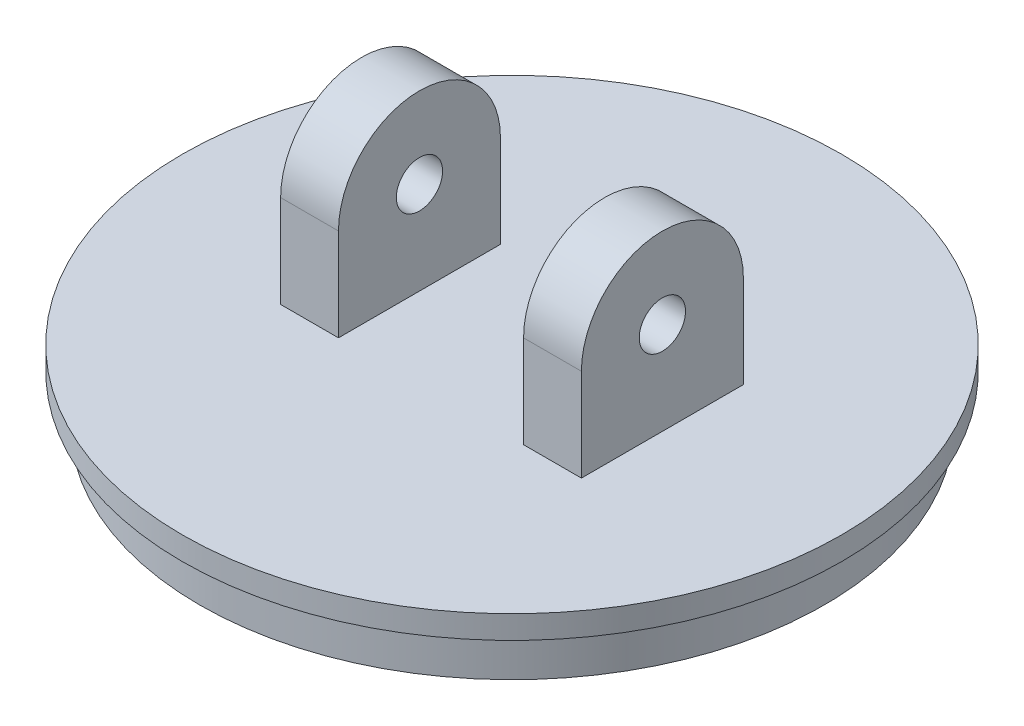
ISO-10303-21;
HEADER;
FILE_DESCRIPTION(('STEP AP214'),'2;1');
FILE_NAME('part.step','',(''),(''),'','','');
FILE_SCHEMA(('AUTOMOTIVE_DESIGN { 1 0 10303 214 1 1 1 1 }'));
ENDSEC;
DATA;
#1=APPLICATION_CONTEXT('core data for automotive mechanical design processes');
#2=APPLICATION_PROTOCOL_DEFINITION('international standard','automotive_design',2000,#1);
#3=PRODUCT_CONTEXT('',#1,'mechanical');
#4=PRODUCT('Part','Part','',(#3));
#5=PRODUCT_RELATED_PRODUCT_CATEGORY('part','',(#4));
#6=PRODUCT_DEFINITION_FORMATION('','',#4);
#7=PRODUCT_DEFINITION_CONTEXT('part definition',#1,'design');
#8=PRODUCT_DEFINITION('design','',#6,#7);
#9=PRODUCT_DEFINITION_SHAPE('','',#8);
#10=(LENGTH_UNIT() NAMED_UNIT(*) SI_UNIT(.MILLI.,.METRE.));
#11=(NAMED_UNIT(*) PLANE_ANGLE_UNIT() SI_UNIT($,.RADIAN.));
#12=(NAMED_UNIT(*) SI_UNIT($,.STERADIAN.) SOLID_ANGLE_UNIT());
#13=UNCERTAINTY_MEASURE_WITH_UNIT(LENGTH_MEASURE(1.E-05),#10,'distance_accuracy_value','');
#14=(GEOMETRIC_REPRESENTATION_CONTEXT(3) GLOBAL_UNCERTAINTY_ASSIGNED_CONTEXT((#13)) GLOBAL_UNIT_ASSIGNED_CONTEXT((#10,
#11,#12)) REPRESENTATION_CONTEXT('',''));
#15=CARTESIAN_POINT('',(0.,0.,0.));
#16=DIRECTION('',(0.,0.,1.));
#17=DIRECTION('',(1.,0.,0.));
#18=AXIS2_PLACEMENT_3D('',#15,#16,#17);
#19=CARTESIAN_POINT('',(40.,110.,-35.));
#20=DIRECTION('',(1.,0.,0.));
#21=DIRECTION('',(0.,0.,-1.));
#22=AXIS2_PLACEMENT_3D('',#19,#20,#21);
#23=PLANE('',#22);
#24=CARTESIAN_POINT('',(40.,70.,0.));
#25=DIRECTION('',(1.,0.,0.));
#26=DIRECTION('',(0.,0.,-1.));
#27=AXIS2_PLACEMENT_3D('',#24,#25,#26);
#28=CIRCLE('',#27,10.);
#29=CARTESIAN_POINT('',(40.,70.,-10.));
#30=VERTEX_POINT('',#29);
#31=EDGE_CURVE('E125',#30,#30,#28,.T.);
#32=ORIENTED_EDGE('',*,*,#31,.T.);
#33=EDGE_LOOP('',(#32));
#34=FACE_BOUND('',#33,.T.);
#35=DIRECTION('',(0.,-1.,0.));
#36=VECTOR('',#35,1.);
#37=CARTESIAN_POINT('',(40.,110.,35.));
#38=LINE('',#37,#36);
#39=CARTESIAN_POINT('',(40.,70.,35.));
#40=VERTEX_POINT('',#39);
#41=CARTESIAN_POINT('',(40.,30.,35.));
#42=VERTEX_POINT('',#41);
#43=EDGE_CURVE('E129',#40,#42,#38,.T.);
#44=ORIENTED_EDGE('',*,*,#43,.F.);
#45=CARTESIAN_POINT('',(40.,70.,0.));
#46=DIRECTION('',(1.,0.,0.));
#47=DIRECTION('',(0.,0.,-1.));
#48=AXIS2_PLACEMENT_3D('',#45,#46,#47);
#49=CIRCLE('',#48,35.);
#50=CARTESIAN_POINT('',(40.,70.,-35.));
#51=VERTEX_POINT('',#50);
#52=EDGE_CURVE('E111',#40,#51,#49,.F.);
#53=ORIENTED_EDGE('',*,*,#52,.T.);
#54=DIRECTION('',(0.,-1.,0.));
#55=VECTOR('',#54,1.);
#56=CARTESIAN_POINT('',(40.,110.,-35.));
#57=LINE('',#56,#55);
#58=CARTESIAN_POINT('',(40.,30.,-35.));
#59=VERTEX_POINT('',#58);
#60=EDGE_CURVE('E135',#51,#59,#57,.T.);
#61=ORIENTED_EDGE('',*,*,#60,.T.);
#62=DIRECTION('',(0.,0.,1.));
#63=VECTOR('',#62,1.);
#64=CARTESIAN_POINT('',(40.,30.,-35.));
#65=LINE('',#64,#63);
#66=EDGE_CURVE('E128',#59,#42,#65,.T.);
#67=ORIENTED_EDGE('',*,*,#66,.T.);
#68=EDGE_LOOP('',(#44,#53,#61,#67));
#69=FACE_BOUND('',#68,.T.);
#70=ADVANCED_FACE('F43',(#34,#69),#23,.F.);
#71=CARTESIAN_POINT('',(65.,110.,35.));
#72=DIRECTION('',(0.,0.,-1.));
#73=DIRECTION('',(-1.,0.,0.));
#74=AXIS2_PLACEMENT_3D('',#71,#72,#73);
#75=PLANE('',#74);
#76=DIRECTION('',(1.,0.,0.));
#77=VECTOR('',#76,1.);
#78=CARTESIAN_POINT('',(-142.5,70.,35.));
#79=LINE('',#78,#77);
#80=CARTESIAN_POINT('',(65.,70.,35.));
#81=VERTEX_POINT('',#80);
#82=EDGE_CURVE('E53',#40,#81,#79,.T.);
#83=ORIENTED_EDGE('',*,*,#82,.F.);
#84=ORIENTED_EDGE('',*,*,#43,.T.);
#85=DIRECTION('',(1.,0.,0.));
#86=VECTOR('',#85,1.);
#87=CARTESIAN_POINT('',(65.,30.,35.));
#88=LINE('',#87,#86);
#89=CARTESIAN_POINT('',(65.,30.,35.));
#90=VERTEX_POINT('',#89);
#91=EDGE_CURVE('E130',#42,#90,#88,.T.);
#92=ORIENTED_EDGE('',*,*,#91,.T.);
#93=DIRECTION('',(0.,-1.,0.));
#94=VECTOR('',#93,1.);
#95=CARTESIAN_POINT('',(65.,110.,35.));
#96=LINE('',#95,#94);
#97=EDGE_CURVE('E118',#81,#90,#96,.T.);
#98=ORIENTED_EDGE('',*,*,#97,.F.);
#99=EDGE_LOOP('',(#83,#84,#92,#98));
#100=FACE_BOUND('',#99,.T.);
#101=ADVANCED_FACE('F123',(#100),#75,.F.);
#102=CARTESIAN_POINT('',(-40.,110.,-35.));
#103=DIRECTION('',(-1.,0.,0.));
#104=DIRECTION('',(0.,0.,1.));
#105=AXIS2_PLACEMENT_3D('',#102,#103,#104);
#106=PLANE('',#105);
#107=CARTESIAN_POINT('',(-40.,70.,0.));
#108=DIRECTION('',(-1.,0.,0.));
#109=DIRECTION('',(0.,0.,1.));
#110=AXIS2_PLACEMENT_3D('',#107,#108,#109);
#111=CIRCLE('',#110,10.);
#112=CARTESIAN_POINT('',(-40.,70.,10.));
#113=VERTEX_POINT('',#112);
#114=EDGE_CURVE('E229',#113,#113,#111,.T.);
#115=ORIENTED_EDGE('',*,*,#114,.T.);
#116=EDGE_LOOP('',(#115));
#117=FACE_BOUND('',#116,.T.);
#118=DIRECTION('',(0.,-1.,0.));
#119=VECTOR('',#118,1.);
#120=CARTESIAN_POINT('',(-40.,110.,-35.));
#121=LINE('',#120,#119);
#122=CARTESIAN_POINT('',(-40.,70.,-35.));
#123=VERTEX_POINT('',#122);
#124=CARTESIAN_POINT('',(-40.,30.,-35.));
#125=VERTEX_POINT('',#124);
#126=EDGE_CURVE('E146',#123,#125,#121,.T.);
#127=ORIENTED_EDGE('',*,*,#126,.F.);
#128=CARTESIAN_POINT('',(-40.,70.,0.));
#129=DIRECTION('',(-1.,0.,0.));
#130=DIRECTION('',(0.,0.,1.));
#131=AXIS2_PLACEMENT_3D('',#128,#129,#130);
#132=CIRCLE('',#131,35.);
#133=CARTESIAN_POINT('',(-40.,70.,35.));
#134=VERTEX_POINT('',#133);
#135=EDGE_CURVE('E239',#123,#134,#132,.F.);
#136=ORIENTED_EDGE('',*,*,#135,.T.);
#137=DIRECTION('',(0.,-1.,0.));
#138=VECTOR('',#137,1.);
#139=CARTESIAN_POINT('',(-40.,110.,35.));
#140=LINE('',#139,#138);
#141=CARTESIAN_POINT('',(-40.,30.,35.));
#142=VERTEX_POINT('',#141);
#143=EDGE_CURVE('E253',#134,#142,#140,.T.);
#144=ORIENTED_EDGE('',*,*,#143,.T.);
#145=DIRECTION('',(0.,0.,-1.));
#146=VECTOR('',#145,1.);
#147=CARTESIAN_POINT('',(-40.,30.,-35.));
#148=LINE('',#147,#146);
#149=EDGE_CURVE('E141',#142,#125,#148,.T.);
#150=ORIENTED_EDGE('',*,*,#149,.T.);
#151=EDGE_LOOP('',(#127,#136,#144,#150));
#152=FACE_BOUND('',#151,.T.);
#153=ADVANCED_FACE('F180',(#117,#152),#106,.F.);
#154=CARTESIAN_POINT('',(-65.,110.,-35.));
#155=DIRECTION('',(1.,0.,0.));
#156=DIRECTION('',(0.,0.,-1.));
#157=AXIS2_PLACEMENT_3D('',#154,#155,#156);
#158=PLANE('',#157);
#159=CARTESIAN_POINT('',(-65.,70.,0.));
#160=DIRECTION('',(1.,0.,0.));
#161=DIRECTION('',(0.,0.,-1.));
#162=AXIS2_PLACEMENT_3D('',#159,#160,#161);
#163=CIRCLE('',#162,10.);
#164=CARTESIAN_POINT('',(-65.,70.,-10.));
#165=VERTEX_POINT('',#164);
#166=EDGE_CURVE('E231',#165,#165,#163,.T.);
#167=ORIENTED_EDGE('',*,*,#166,.T.);
#168=EDGE_LOOP('',(#167));
#169=FACE_BOUND('',#168,.T.);
#170=DIRECTION('',(0.,-1.,0.));
#171=VECTOR('',#170,1.);
#172=CARTESIAN_POINT('',(-65.,110.,35.));
#173=LINE('',#172,#171);
#174=CARTESIAN_POINT('',(-65.,70.,35.));
#175=VERTEX_POINT('',#174);
#176=CARTESIAN_POINT('',(-65.,30.,35.));
#177=VERTEX_POINT('',#176);
#178=EDGE_CURVE('E260',#175,#177,#173,.T.);
#179=ORIENTED_EDGE('',*,*,#178,.F.);
#180=CARTESIAN_POINT('',(-65.,70.,0.));
#181=DIRECTION('',(1.,0.,0.));
#182=DIRECTION('',(0.,0.,-1.));
#183=AXIS2_PLACEMENT_3D('',#180,#181,#182);
#184=CIRCLE('',#183,35.);
#185=CARTESIAN_POINT('',(-65.,70.,-35.));
#186=VERTEX_POINT('',#185);
#187=EDGE_CURVE('E238',#175,#186,#184,.F.);
#188=ORIENTED_EDGE('',*,*,#187,.T.);
#189=DIRECTION('',(0.,-1.,0.));
#190=VECTOR('',#189,1.);
#191=CARTESIAN_POINT('',(-65.,110.,-35.));
#192=LINE('',#191,#190);
#193=CARTESIAN_POINT('',(-65.,30.,-35.));
#194=VERTEX_POINT('',#193);
#195=EDGE_CURVE('E256',#186,#194,#192,.T.);
#196=ORIENTED_EDGE('',*,*,#195,.T.);
#197=DIRECTION('',(0.,0.,1.));
#198=VECTOR('',#197,1.);
#199=CARTESIAN_POINT('',(-65.,30.,-35.));
#200=LINE('',#199,#198);
#201=EDGE_CURVE('E248',#194,#177,#200,.T.);
#202=ORIENTED_EDGE('',*,*,#201,.T.);
#203=EDGE_LOOP('',(#179,#188,#196,#202));
#204=FACE_BOUND('',#203,.T.);
#205=ADVANCED_FACE('F210',(#169,#204),#158,.F.);
#206=CARTESIAN_POINT('',(-40.,110.,35.));
#207=DIRECTION('',(0.,0.,-1.));
#208=DIRECTION('',(-1.,0.,0.));
#209=AXIS2_PLACEMENT_3D('',#206,#207,#208);
#210=PLANE('',#209);
#211=EDGE_CURVE('E11',#175,#134,#79,.T.);
#212=ORIENTED_EDGE('',*,*,#211,.F.);
#213=ORIENTED_EDGE('',*,*,#178,.T.);
#214=DIRECTION('',(1.,0.,0.));
#215=VECTOR('',#214,1.);
#216=CARTESIAN_POINT('',(-40.,30.,35.));
#217=LINE('',#216,#215);
#218=EDGE_CURVE('E255',#177,#142,#217,.T.);
#219=ORIENTED_EDGE('',*,*,#218,.T.);
#220=ORIENTED_EDGE('',*,*,#143,.F.);
#221=EDGE_LOOP('',(#212,#213,#219,#220));
#222=FACE_BOUND('',#221,.T.);
#223=ADVANCED_FACE('F170',(#222),#210,.F.);
#224=CARTESIAN_POINT('',(0.,20.,0.));
#225=DIRECTION('',(0.,-1.,0.));
#226=DIRECTION('',(0.,0.,-1.));
#227=AXIS2_PLACEMENT_3D('',#224,#225,#226);
#228=CYLINDRICAL_SURFACE('',#227,135.);
#229=CARTESIAN_POINT('',(0.,20.,0.));
#230=DIRECTION('',(0.,1.,0.));
#231=DIRECTION('',(0.,0.,1.));
#232=AXIS2_PLACEMENT_3D('',#229,#230,#231);
#233=CIRCLE('',#232,135.);
#234=CARTESIAN_POINT('',(0.,20.,135.));
#235=VERTEX_POINT('',#234);
#236=EDGE_CURVE('E55',#235,#235,#233,.T.);
#237=ORIENTED_EDGE('',*,*,#236,.F.);
#238=EDGE_LOOP('',(#237));
#239=FACE_BOUND('',#238,.T.);
#240=CARTESIAN_POINT('',(0.,0.,0.));
#241=DIRECTION('',(0.,1.,0.));
#242=DIRECTION('',(0.,0.,1.));
#243=AXIS2_PLACEMENT_3D('',#240,#241,#242);
#244=CIRCLE('',#243,135.);
#245=CARTESIAN_POINT('',(0.,0.,135.));
#246=VERTEX_POINT('',#245);
#247=EDGE_CURVE('E50',#246,#246,#244,.T.);
#248=ORIENTED_EDGE('',*,*,#247,.T.);
#249=EDGE_LOOP('',(#248));
#250=FACE_BOUND('',#249,.T.);
#251=ADVANCED_FACE('F44',(#239,#250),#228,.T.);
#252=CARTESIAN_POINT('',(0.,0.,0.));
#253=DIRECTION('',(0.,1.,0.));
#254=DIRECTION('',(0.,0.,1.));
#255=AXIS2_PLACEMENT_3D('',#252,#253,#254);
#256=PLANE('',#255);
#257=ORIENTED_EDGE('',*,*,#247,.F.);
#258=EDGE_LOOP('',(#257));
#259=FACE_BOUND('',#258,.T.);
#260=ADVANCED_FACE('F160',(#259),#256,.F.);
#261=CARTESIAN_POINT('',(0.,30.,0.));
#262=DIRECTION('',(0.,-1.,0.));
#263=DIRECTION('',(0.,0.,-1.));
#264=AXIS2_PLACEMENT_3D('',#261,#262,#263);
#265=CYLINDRICAL_SURFACE('',#264,142.5);
#266=CARTESIAN_POINT('',(0.,30.,0.));
#267=DIRECTION('',(0.,1.,0.));
#268=DIRECTION('',(0.,0.,1.));
#269=AXIS2_PLACEMENT_3D('',#266,#267,#268);
#270=CIRCLE('',#269,142.5);
#271=CARTESIAN_POINT('',(0.,30.,142.5));
#272=VERTEX_POINT('',#271);
#273=EDGE_CURVE('E144',#272,#272,#270,.T.);
#274=ORIENTED_EDGE('',*,*,#273,.F.);
#275=EDGE_LOOP('',(#274));
#276=FACE_BOUND('',#275,.T.);
#277=CARTESIAN_POINT('',(0.,20.,0.));
#278=DIRECTION('',(0.,1.,0.));
#279=DIRECTION('',(0.,0.,1.));
#280=AXIS2_PLACEMENT_3D('',#277,#278,#279);
#281=CIRCLE('',#280,142.5);
#282=CARTESIAN_POINT('',(0.,20.,142.5));
#283=VERTEX_POINT('',#282);
#284=EDGE_CURVE('E150',#283,#283,#281,.T.);
#285=ORIENTED_EDGE('',*,*,#284,.T.);
#286=EDGE_LOOP('',(#285));
#287=FACE_BOUND('',#286,.T.);
#288=ADVANCED_FACE('F158',(#276,#287),#265,.T.);
#289=CARTESIAN_POINT('',(0.,30.,0.));
#290=DIRECTION('',(0.,1.,0.));
#291=DIRECTION('',(0.,0.,1.));
#292=AXIS2_PLACEMENT_3D('',#289,#290,#291);
#293=PLANE('',#292);
#294=ORIENTED_EDGE('',*,*,#149,.F.);
#295=ORIENTED_EDGE('',*,*,#218,.F.);
#296=ORIENTED_EDGE('',*,*,#201,.F.);
#297=DIRECTION('',(-1.,0.,0.));
#298=VECTOR('',#297,1.);
#299=CARTESIAN_POINT('',(-40.,30.,-35.));
#300=LINE('',#299,#298);
#301=EDGE_CURVE('E246',#125,#194,#300,.T.);
#302=ORIENTED_EDGE('',*,*,#301,.F.);
#303=EDGE_LOOP('',(#294,#295,#296,#302));
#304=FACE_BOUND('',#303,.T.);
#305=DIRECTION('',(0.,0.,-1.));
#306=VECTOR('',#305,1.);
#307=CARTESIAN_POINT('',(65.,30.,-35.));
#308=LINE('',#307,#306);
#309=CARTESIAN_POINT('',(65.,30.,-35.));
#310=VERTEX_POINT('',#309);
#311=EDGE_CURVE('E142',#90,#310,#308,.T.);
#312=ORIENTED_EDGE('',*,*,#311,.F.);
#313=ORIENTED_EDGE('',*,*,#91,.F.);
#314=ORIENTED_EDGE('',*,*,#66,.F.);
#315=DIRECTION('',(-1.,0.,0.));
#316=VECTOR('',#315,1.);
#317=CARTESIAN_POINT('',(65.,30.,-35.));
#318=LINE('',#317,#316);
#319=EDGE_CURVE('E137',#310,#59,#318,.T.);
#320=ORIENTED_EDGE('',*,*,#319,.F.);
#321=EDGE_LOOP('',(#312,#313,#314,#320));
#322=FACE_BOUND('',#321,.T.);
#323=ORIENTED_EDGE('',*,*,#273,.T.);
#324=EDGE_LOOP('',(#323));
#325=FACE_BOUND('',#324,.T.);
#326=ADVANCED_FACE('F165',(#304,#322,#325),#293,.T.);
#327=CARTESIAN_POINT('',(0.,20.,0.));
#328=DIRECTION('',(0.,1.,0.));
#329=DIRECTION('',(0.,0.,1.));
#330=AXIS2_PLACEMENT_3D('',#327,#328,#329);
#331=PLANE('',#330);
#332=ORIENTED_EDGE('',*,*,#236,.T.);
#333=EDGE_LOOP('',(#332));
#334=FACE_BOUND('',#333,.T.);
#335=ORIENTED_EDGE('',*,*,#284,.F.);
#336=EDGE_LOOP('',(#335));
#337=FACE_BOUND('',#336,.T.);
#338=ADVANCED_FACE('F190',(#334,#337),#331,.F.);
#339=CARTESIAN_POINT('',(65.,110.,-35.));
#340=DIRECTION('',(-1.,0.,0.));
#341=DIRECTION('',(0.,0.,1.));
#342=AXIS2_PLACEMENT_3D('',#339,#340,#341);
#343=PLANE('',#342);
#344=CARTESIAN_POINT('',(65.,70.,0.));
#345=DIRECTION('',(1.,0.,0.));
#346=DIRECTION('',(0.,0.,-1.));
#347=AXIS2_PLACEMENT_3D('',#344,#345,#346);
#348=CIRCLE('',#347,10.);
#349=CARTESIAN_POINT('',(65.,70.,-10.));
#350=VERTEX_POINT('',#349);
#351=EDGE_CURVE('E226',#350,#350,#348,.T.);
#352=ORIENTED_EDGE('',*,*,#351,.F.);
#353=EDGE_LOOP('',(#352));
#354=FACE_BOUND('',#353,.T.);
#355=CARTESIAN_POINT('',(65.,70.,0.));
#356=DIRECTION('',(1.,0.,0.));
#357=DIRECTION('',(0.,0.,-1.));
#358=AXIS2_PLACEMENT_3D('',#355,#356,#357);
#359=CIRCLE('',#358,35.);
#360=CARTESIAN_POINT('',(65.,70.,-35.));
#361=VERTEX_POINT('',#360);
#362=EDGE_CURVE('E109',#81,#361,#359,.F.);
#363=ORIENTED_EDGE('',*,*,#362,.F.);
#364=ORIENTED_EDGE('',*,*,#97,.T.);
#365=ORIENTED_EDGE('',*,*,#311,.T.);
#366=DIRECTION('',(0.,-1.,0.));
#367=VECTOR('',#366,1.);
#368=CARTESIAN_POINT('',(65.,110.,-35.));
#369=LINE('',#368,#367);
#370=EDGE_CURVE('E122',#361,#310,#369,.T.);
#371=ORIENTED_EDGE('',*,*,#370,.F.);
#372=EDGE_LOOP('',(#363,#364,#365,#371));
#373=FACE_BOUND('',#372,.T.);
#374=ADVANCED_FACE('F120',(#354,#373),#343,.F.);
#375=CARTESIAN_POINT('',(65.,110.,-35.));
#376=DIRECTION('',(0.,0.,1.));
#377=DIRECTION('',(1.,0.,0.));
#378=AXIS2_PLACEMENT_3D('',#375,#376,#377);
#379=PLANE('',#378);
#380=ORIENTED_EDGE('',*,*,#60,.F.);
#381=DIRECTION('',(1.,0.,0.));
#382=VECTOR('',#381,1.);
#383=CARTESIAN_POINT('',(-142.5,70.,-35.));
#384=LINE('',#383,#382);
#385=EDGE_CURVE('E62',#51,#361,#384,.T.);
#386=ORIENTED_EDGE('',*,*,#385,.T.);
#387=ORIENTED_EDGE('',*,*,#370,.T.);
#388=ORIENTED_EDGE('',*,*,#319,.T.);
#389=EDGE_LOOP('',(#380,#386,#387,#388));
#390=FACE_BOUND('',#389,.T.);
#391=ADVANCED_FACE('F185',(#390),#379,.F.);
#392=CARTESIAN_POINT('',(-40.,110.,-35.));
#393=DIRECTION('',(0.,0.,1.));
#394=DIRECTION('',(1.,0.,0.));
#395=AXIS2_PLACEMENT_3D('',#392,#393,#394);
#396=PLANE('',#395);
#397=ORIENTED_EDGE('',*,*,#195,.F.);
#398=EDGE_CURVE('E69',#186,#123,#384,.T.);
#399=ORIENTED_EDGE('',*,*,#398,.T.);
#400=ORIENTED_EDGE('',*,*,#126,.T.);
#401=ORIENTED_EDGE('',*,*,#301,.T.);
#402=EDGE_LOOP('',(#397,#399,#400,#401));
#403=FACE_BOUND('',#402,.T.);
#404=ADVANCED_FACE('F205',(#403),#396,.F.);
#405=CARTESIAN_POINT('',(-142.5,70.,0.));
#406=DIRECTION('',(1.,0.,0.));
#407=DIRECTION('',(0.,0.,-1.));
#408=AXIS2_PLACEMENT_3D('',#405,#406,#407);
#409=CYLINDRICAL_SURFACE('',#408,35.);
#410=ORIENTED_EDGE('',*,*,#398,.F.);
#411=ORIENTED_EDGE('',*,*,#187,.F.);
#412=ORIENTED_EDGE('',*,*,#211,.T.);
#413=ORIENTED_EDGE('',*,*,#135,.F.);
#414=EDGE_LOOP('',(#410,#411,#412,#413));
#415=FACE_BOUND('',#414,.T.);
#416=ADVANCED_FACE('F212',(#415),#409,.T.);
#417=ORIENTED_EDGE('',*,*,#82,.T.);
#418=ORIENTED_EDGE('',*,*,#362,.T.);
#419=ORIENTED_EDGE('',*,*,#385,.F.);
#420=ORIENTED_EDGE('',*,*,#52,.F.);
#421=EDGE_LOOP('',(#417,#418,#419,#420));
#422=FACE_BOUND('',#421,.T.);
#423=ADVANCED_FACE('F107',(#422),#409,.T.);
#424=CARTESIAN_POINT('',(-142.5,70.,0.));
#425=DIRECTION('',(1.,0.,0.));
#426=DIRECTION('',(0.,0.,-1.));
#427=AXIS2_PLACEMENT_3D('',#424,#425,#426);
#428=CYLINDRICAL_SURFACE('',#427,10.);
#429=ORIENTED_EDGE('',*,*,#351,.T.);
#430=EDGE_LOOP('',(#429));
#431=FACE_BOUND('',#430,.T.);
#432=ORIENTED_EDGE('',*,*,#31,.F.);
#433=EDGE_LOOP('',(#432));
#434=FACE_BOUND('',#433,.T.);
#435=ADVANCED_FACE('F219',(#431,#434),#428,.F.);
#436=ORIENTED_EDGE('',*,*,#166,.F.);
#437=EDGE_LOOP('',(#436));
#438=FACE_BOUND('',#437,.T.);
#439=ORIENTED_EDGE('',*,*,#114,.F.);
#440=EDGE_LOOP('',(#439));
#441=FACE_BOUND('',#440,.T.);
#442=ADVANCED_FACE('F216',(#438,#441),#428,.F.);
#443=CLOSED_SHELL('',(#70,#101,#153,#205,#223,#251,#260,#288,#326,#338,#374,#391,#404,#416,#423,
#435,#442));
#444=MANIFOLD_SOLID_BREP('B2',#443);
#445=ADVANCED_BREP_SHAPE_REPRESENTATION('',(#18,#444),#14);
#446=SHAPE_DEFINITION_REPRESENTATION(#9,#445);
ENDSEC;
END-ISO-10303-21;
